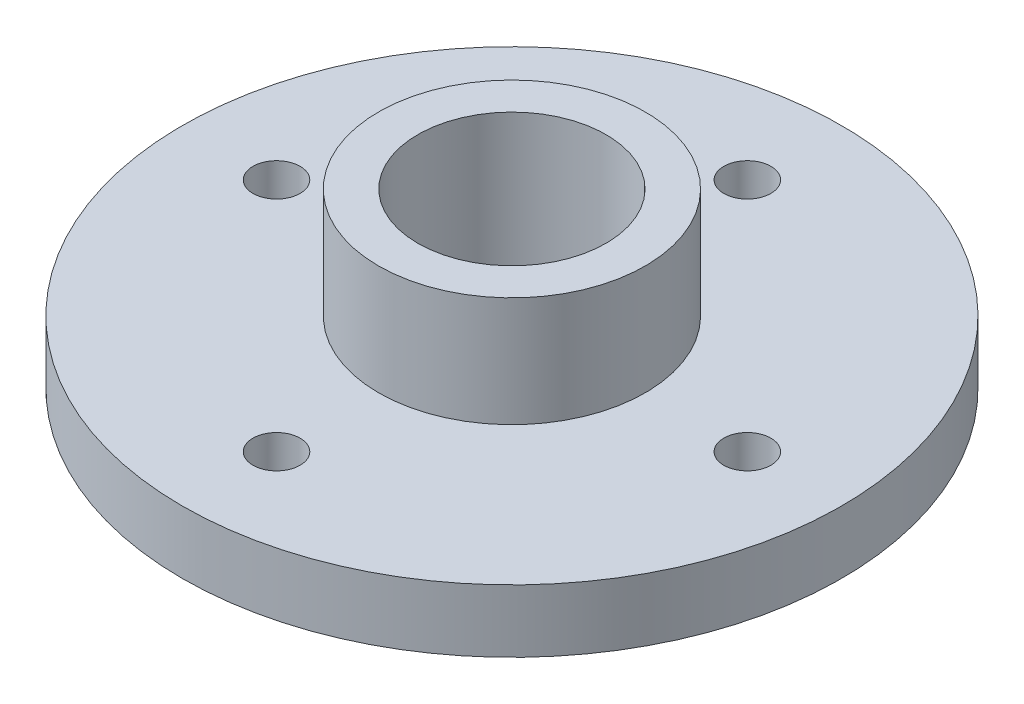
ISO-10303-21;
HEADER;
FILE_DESCRIPTION(('STEP AP214'),'2;1');
FILE_NAME('part.step','',(''),(''),'','','');
FILE_SCHEMA(('AUTOMOTIVE_DESIGN { 1 0 10303 214 1 1 1 1 }'));
ENDSEC;
DATA;
#1=APPLICATION_CONTEXT('core data for automotive mechanical design processes');
#2=APPLICATION_PROTOCOL_DEFINITION('international standard','automotive_design',2000,#1);
#3=PRODUCT_CONTEXT('',#1,'mechanical');
#4=PRODUCT('Part','Part','',(#3));
#5=PRODUCT_RELATED_PRODUCT_CATEGORY('part','',(#4));
#6=PRODUCT_DEFINITION_FORMATION('','',#4);
#7=PRODUCT_DEFINITION_CONTEXT('part definition',#1,'design');
#8=PRODUCT_DEFINITION('design','',#6,#7);
#9=PRODUCT_DEFINITION_SHAPE('','',#8);
#10=(LENGTH_UNIT() NAMED_UNIT(*) SI_UNIT(.MILLI.,.METRE.));
#11=(NAMED_UNIT(*) PLANE_ANGLE_UNIT() SI_UNIT($,.RADIAN.));
#12=(NAMED_UNIT(*) SI_UNIT($,.STERADIAN.) SOLID_ANGLE_UNIT());
#13=UNCERTAINTY_MEASURE_WITH_UNIT(LENGTH_MEASURE(1.E-05),#10,'distance_accuracy_value','');
#14=(GEOMETRIC_REPRESENTATION_CONTEXT(3) GLOBAL_UNCERTAINTY_ASSIGNED_CONTEXT((#13)) GLOBAL_UNIT_ASSIGNED_CONTEXT((#10,
#11,#12)) REPRESENTATION_CONTEXT('',''));
#15=CARTESIAN_POINT('',(0.,0.,0.));
#16=DIRECTION('',(0.,0.,1.));
#17=DIRECTION('',(1.,0.,0.));
#18=AXIS2_PLACEMENT_3D('',#15,#16,#17);
#19=CARTESIAN_POINT('',(0.,2.,0.));
#20=DIRECTION('',(0.,-1.,0.));
#21=DIRECTION('',(0.,0.,-1.));
#22=AXIS2_PLACEMENT_3D('',#19,#20,#21);
#23=CYLINDRICAL_SURFACE('',#22,10.5);
#24=CARTESIAN_POINT('',(0.,2.,0.));
#25=DIRECTION('',(0.,1.,0.));
#26=DIRECTION('',(0.,0.,1.));
#27=AXIS2_PLACEMENT_3D('',#24,#25,#26);
#28=CIRCLE('',#27,10.5);
#29=CARTESIAN_POINT('',(0.,2.,10.5));
#30=VERTEX_POINT('',#29);
#31=EDGE_CURVE('E10',#30,#30,#28,.T.);
#32=ORIENTED_EDGE('',*,*,#31,.F.);
#33=EDGE_LOOP('',(#32));
#34=FACE_BOUND('',#33,.T.);
#35=CARTESIAN_POINT('',(0.,0.,0.));
#36=DIRECTION('',(0.,1.,0.));
#37=DIRECTION('',(0.,0.,1.));
#38=AXIS2_PLACEMENT_3D('',#35,#36,#37);
#39=CIRCLE('',#38,10.5);
#40=CARTESIAN_POINT('',(0.,0.,10.5));
#41=VERTEX_POINT('',#40);
#42=EDGE_CURVE('E40',#41,#41,#39,.T.);
#43=ORIENTED_EDGE('',*,*,#42,.T.);
#44=EDGE_LOOP('',(#43));
#45=FACE_BOUND('',#44,.T.);
#46=ADVANCED_FACE('F33',(#34,#45),#23,.T.);
#47=CARTESIAN_POINT('',(0.,2.,0.));
#48=DIRECTION('',(0.,1.,0.));
#49=DIRECTION('',(0.,0.,1.));
#50=AXIS2_PLACEMENT_3D('',#47,#48,#49);
#51=PLANE('',#50);
#52=CARTESIAN_POINT('',(0.,2.,-7.5));
#53=DIRECTION('',(0.,1.,0.));
#54=DIRECTION('',(0.,0.,1.));
#55=AXIS2_PLACEMENT_3D('',#52,#53,#54);
#56=CIRCLE('',#55,0.75);
#57=CARTESIAN_POINT('',(0.,2.,-6.75));
#58=VERTEX_POINT('',#57);
#59=EDGE_CURVE('E55',#58,#58,#56,.T.);
#60=ORIENTED_EDGE('',*,*,#59,.F.);
#61=EDGE_LOOP('',(#60));
#62=FACE_BOUND('',#61,.T.);
#63=CARTESIAN_POINT('',(0.,2.,7.5));
#64=DIRECTION('',(0.,1.,0.));
#65=DIRECTION('',(0.,0.,1.));
#66=AXIS2_PLACEMENT_3D('',#63,#64,#65);
#67=CIRCLE('',#66,0.75);
#68=CARTESIAN_POINT('',(0.,2.,8.25));
#69=VERTEX_POINT('',#68);
#70=EDGE_CURVE('E123',#69,#69,#67,.T.);
#71=ORIENTED_EDGE('',*,*,#70,.F.);
#72=EDGE_LOOP('',(#71));
#73=FACE_BOUND('',#72,.T.);
#74=CARTESIAN_POINT('',(7.5,2.,0.));
#75=DIRECTION('',(0.,1.,0.));
#76=DIRECTION('',(0.,0.,1.));
#77=AXIS2_PLACEMENT_3D('',#74,#75,#76);
#78=CIRCLE('',#77,0.749999999999999);
#79=CARTESIAN_POINT('',(7.5,2.,0.749999999999999));
#80=VERTEX_POINT('',#79);
#81=EDGE_CURVE('E126',#80,#80,#78,.T.);
#82=ORIENTED_EDGE('',*,*,#81,.F.);
#83=EDGE_LOOP('',(#82));
#84=FACE_BOUND('',#83,.T.);
#85=CARTESIAN_POINT('',(-7.5,2.,0.));
#86=DIRECTION('',(0.,1.,0.));
#87=DIRECTION('',(0.,0.,1.));
#88=AXIS2_PLACEMENT_3D('',#85,#86,#87);
#89=CIRCLE('',#88,0.749999999999999);
#90=CARTESIAN_POINT('',(-7.5,2.,0.749999999999999));
#91=VERTEX_POINT('',#90);
#92=EDGE_CURVE('E71',#91,#91,#89,.T.);
#93=ORIENTED_EDGE('',*,*,#92,.F.);
#94=EDGE_LOOP('',(#93));
#95=FACE_BOUND('',#94,.T.);
#96=CARTESIAN_POINT('',(0.,2.,0.));
#97=DIRECTION('',(0.,1.,0.));
#98=DIRECTION('',(0.,0.,1.));
#99=AXIS2_PLACEMENT_3D('',#96,#97,#98);
#100=CIRCLE('',#99,4.25);
#101=CARTESIAN_POINT('',(0.,2.,4.25));
#102=VERTEX_POINT('',#101);
#103=EDGE_CURVE('E48',#102,#102,#100,.T.);
#104=ORIENTED_EDGE('',*,*,#103,.F.);
#105=EDGE_LOOP('',(#104));
#106=FACE_BOUND('',#105,.T.);
#107=ORIENTED_EDGE('',*,*,#31,.T.);
#108=EDGE_LOOP('',(#107));
#109=FACE_BOUND('',#108,.T.);
#110=ADVANCED_FACE('F86',(#62,#73,#84,#95,#106,#109),#51,.T.);
#111=CARTESIAN_POINT('',(0.,0.,0.));
#112=DIRECTION('',(0.,1.,0.));
#113=DIRECTION('',(0.,0.,1.));
#114=AXIS2_PLACEMENT_3D('',#111,#112,#113);
#115=PLANE('',#114);
#116=CARTESIAN_POINT('',(0.,0.,0.));
#117=DIRECTION('',(0.,1.,0.));
#118=DIRECTION('',(0.,0.,1.));
#119=AXIS2_PLACEMENT_3D('',#116,#117,#118);
#120=CIRCLE('',#119,3.);
#121=CARTESIAN_POINT('',(0.,0.,3.));
#122=VERTEX_POINT('',#121);
#123=EDGE_CURVE('E36',#122,#122,#120,.T.);
#124=ORIENTED_EDGE('',*,*,#123,.T.);
#125=EDGE_LOOP('',(#124));
#126=FACE_BOUND('',#125,.T.);
#127=CARTESIAN_POINT('',(0.,0.,-7.5));
#128=DIRECTION('',(0.,1.,0.));
#129=DIRECTION('',(0.,0.,1.));
#130=AXIS2_PLACEMENT_3D('',#127,#128,#129);
#131=CIRCLE('',#130,0.75);
#132=CARTESIAN_POINT('',(0.,0.,-6.75));
#133=VERTEX_POINT('',#132);
#134=EDGE_CURVE('E60',#133,#133,#131,.T.);
#135=ORIENTED_EDGE('',*,*,#134,.T.);
#136=EDGE_LOOP('',(#135));
#137=FACE_BOUND('',#136,.T.);
#138=CARTESIAN_POINT('',(0.,0.,7.5));
#139=DIRECTION('',(0.,1.,0.));
#140=DIRECTION('',(0.,0.,1.));
#141=AXIS2_PLACEMENT_3D('',#138,#139,#140);
#142=CIRCLE('',#141,0.75);
#143=CARTESIAN_POINT('',(0.,0.,8.25));
#144=VERTEX_POINT('',#143);
#145=EDGE_CURVE('E58',#144,#144,#142,.T.);
#146=ORIENTED_EDGE('',*,*,#145,.T.);
#147=EDGE_LOOP('',(#146));
#148=FACE_BOUND('',#147,.T.);
#149=CARTESIAN_POINT('',(7.5,0.,0.));
#150=DIRECTION('',(0.,1.,0.));
#151=DIRECTION('',(0.,0.,1.));
#152=AXIS2_PLACEMENT_3D('',#149,#150,#151);
#153=CIRCLE('',#152,0.749999999999999);
#154=CARTESIAN_POINT('',(7.5,0.,0.749999999999999));
#155=VERTEX_POINT('',#154);
#156=EDGE_CURVE('E54',#155,#155,#153,.T.);
#157=ORIENTED_EDGE('',*,*,#156,.T.);
#158=EDGE_LOOP('',(#157));
#159=FACE_BOUND('',#158,.T.);
#160=CARTESIAN_POINT('',(-7.5,0.,0.));
#161=DIRECTION('',(0.,1.,0.));
#162=DIRECTION('',(0.,0.,1.));
#163=AXIS2_PLACEMENT_3D('',#160,#161,#162);
#164=CIRCLE('',#163,0.749999999999999);
#165=CARTESIAN_POINT('',(-7.5,0.,0.749999999999999));
#166=VERTEX_POINT('',#165);
#167=EDGE_CURVE('E51',#166,#166,#164,.T.);
#168=ORIENTED_EDGE('',*,*,#167,.T.);
#169=EDGE_LOOP('',(#168));
#170=FACE_BOUND('',#169,.T.);
#171=ORIENTED_EDGE('',*,*,#42,.F.);
#172=EDGE_LOOP('',(#171));
#173=FACE_BOUND('',#172,.T.);
#174=ADVANCED_FACE('F88',(#126,#137,#148,#159,#170,#173),#115,.F.);
#175=CARTESIAN_POINT('',(0.,5.5,0.));
#176=DIRECTION('',(0.,1.,0.));
#177=DIRECTION('',(0.,0.,1.));
#178=AXIS2_PLACEMENT_3D('',#175,#176,#177);
#179=PLANE('',#178);
#180=CARTESIAN_POINT('',(0.,5.5,0.));
#181=DIRECTION('',(0.,1.,0.));
#182=DIRECTION('',(0.,0.,1.));
#183=AXIS2_PLACEMENT_3D('',#180,#181,#182);
#184=CIRCLE('',#183,4.25);
#185=CARTESIAN_POINT('',(0.,5.5,4.25));
#186=VERTEX_POINT('',#185);
#187=EDGE_CURVE('E45',#186,#186,#184,.T.);
#188=ORIENTED_EDGE('',*,*,#187,.T.);
#189=EDGE_LOOP('',(#188));
#190=FACE_BOUND('',#189,.T.);
#191=CARTESIAN_POINT('',(0.,5.5,0.));
#192=DIRECTION('',(0.,1.,0.));
#193=DIRECTION('',(0.,0.,1.));
#194=AXIS2_PLACEMENT_3D('',#191,#192,#193);
#195=CIRCLE('',#194,3.);
#196=CARTESIAN_POINT('',(0.,5.5,3.));
#197=VERTEX_POINT('',#196);
#198=EDGE_CURVE('E62',#197,#197,#195,.T.);
#199=ORIENTED_EDGE('',*,*,#198,.F.);
#200=EDGE_LOOP('',(#199));
#201=FACE_BOUND('',#200,.T.);
#202=ADVANCED_FACE('F76',(#190,#201),#179,.T.);
#203=CARTESIAN_POINT('',(0.,5.5,0.));
#204=DIRECTION('',(0.,-1.,0.));
#205=DIRECTION('',(0.,0.,-1.));
#206=AXIS2_PLACEMENT_3D('',#203,#204,#205);
#207=CYLINDRICAL_SURFACE('',#206,4.25);
#208=ORIENTED_EDGE('',*,*,#187,.F.);
#209=EDGE_LOOP('',(#208));
#210=FACE_BOUND('',#209,.T.);
#211=ORIENTED_EDGE('',*,*,#103,.T.);
#212=EDGE_LOOP('',(#211));
#213=FACE_BOUND('',#212,.T.);
#214=ADVANCED_FACE('F79',(#210,#213),#207,.T.);
#215=CARTESIAN_POINT('',(0.,5.5,0.));
#216=DIRECTION('',(0.,-1.,0.));
#217=DIRECTION('',(0.,0.,-1.));
#218=AXIS2_PLACEMENT_3D('',#215,#216,#217);
#219=CYLINDRICAL_SURFACE('',#218,3.);
#220=ORIENTED_EDGE('',*,*,#198,.T.);
#221=EDGE_LOOP('',(#220));
#222=FACE_BOUND('',#221,.T.);
#223=ORIENTED_EDGE('',*,*,#123,.F.);
#224=EDGE_LOOP('',(#223));
#225=FACE_BOUND('',#224,.T.);
#226=ADVANCED_FACE('F82',(#222,#225),#219,.F.);
#227=CARTESIAN_POINT('',(-7.5,-1.5,0.));
#228=DIRECTION('',(0.,1.,0.));
#229=DIRECTION('',(0.,0.,1.));
#230=AXIS2_PLACEMENT_3D('',#227,#228,#229);
#231=CYLINDRICAL_SURFACE('',#230,0.749999999999999);
#232=ORIENTED_EDGE('',*,*,#92,.T.);
#233=EDGE_LOOP('',(#232));
#234=FACE_BOUND('',#233,.T.);
#235=ORIENTED_EDGE('',*,*,#167,.F.);
#236=EDGE_LOOP('',(#235));
#237=FACE_BOUND('',#236,.T.);
#238=ADVANCED_FACE('F104',(#234,#237),#231,.F.);
#239=CARTESIAN_POINT('',(7.5,-1.5,0.));
#240=DIRECTION('',(0.,1.,0.));
#241=DIRECTION('',(0.,0.,1.));
#242=AXIS2_PLACEMENT_3D('',#239,#240,#241);
#243=CYLINDRICAL_SURFACE('',#242,0.749999999999999);
#244=ORIENTED_EDGE('',*,*,#81,.T.);
#245=EDGE_LOOP('',(#244));
#246=FACE_BOUND('',#245,.T.);
#247=ORIENTED_EDGE('',*,*,#156,.F.);
#248=EDGE_LOOP('',(#247));
#249=FACE_BOUND('',#248,.T.);
#250=ADVANCED_FACE('F107',(#246,#249),#243,.F.);
#251=CARTESIAN_POINT('',(0.,-1.5,7.5));
#252=DIRECTION('',(0.,1.,0.));
#253=DIRECTION('',(0.,0.,1.));
#254=AXIS2_PLACEMENT_3D('',#251,#252,#253);
#255=CYLINDRICAL_SURFACE('',#254,0.75);
#256=ORIENTED_EDGE('',*,*,#70,.T.);
#257=EDGE_LOOP('',(#256));
#258=FACE_BOUND('',#257,.T.);
#259=ORIENTED_EDGE('',*,*,#145,.F.);
#260=EDGE_LOOP('',(#259));
#261=FACE_BOUND('',#260,.T.);
#262=ADVANCED_FACE('F111',(#258,#261),#255,.F.);
#263=CARTESIAN_POINT('',(0.,-1.5,-7.5));
#264=DIRECTION('',(0.,1.,0.));
#265=DIRECTION('',(0.,0.,1.));
#266=AXIS2_PLACEMENT_3D('',#263,#264,#265);
#267=CYLINDRICAL_SURFACE('',#266,0.75);
#268=ORIENTED_EDGE('',*,*,#59,.T.);
#269=EDGE_LOOP('',(#268));
#270=FACE_BOUND('',#269,.T.);
#271=ORIENTED_EDGE('',*,*,#134,.F.);
#272=EDGE_LOOP('',(#271));
#273=FACE_BOUND('',#272,.T.);
#274=ADVANCED_FACE('F115',(#270,#273),#267,.F.);
#275=CLOSED_SHELL('',(#46,#110,#174,#202,#214,#226,#238,#250,#262,#274));
#276=MANIFOLD_SOLID_BREP('B2',#275);
#277=ADVANCED_BREP_SHAPE_REPRESENTATION('',(#18,#276),#14);
#278=SHAPE_DEFINITION_REPRESENTATION(#9,#277);
ENDSEC;
END-ISO-10303-21;
